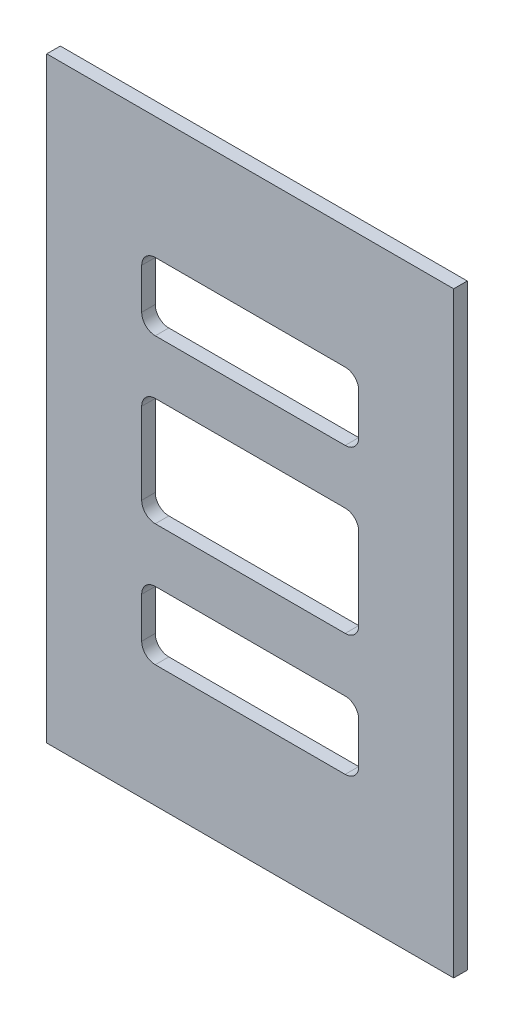
ISO-10303-21;
HEADER;
FILE_DESCRIPTION(('STEP AP214'),'2;1');
FILE_NAME('part.step','',(''),(''),'','','');
FILE_SCHEMA(('AUTOMOTIVE_DESIGN { 1 0 10303 214 1 1 1 1 }'));
ENDSEC;
DATA;
#1=APPLICATION_CONTEXT('core data for automotive mechanical design processes');
#2=APPLICATION_PROTOCOL_DEFINITION('international standard','automotive_design',2000,#1);
#3=PRODUCT_CONTEXT('',#1,'mechanical');
#4=PRODUCT('Part','Part','',(#3));
#5=PRODUCT_RELATED_PRODUCT_CATEGORY('part','',(#4));
#6=PRODUCT_DEFINITION_FORMATION('','',#4);
#7=PRODUCT_DEFINITION_CONTEXT('part definition',#1,'design');
#8=PRODUCT_DEFINITION('design','',#6,#7);
#9=PRODUCT_DEFINITION_SHAPE('','',#8);
#10=(LENGTH_UNIT() NAMED_UNIT(*) SI_UNIT(.MILLI.,.METRE.));
#11=(NAMED_UNIT(*) PLANE_ANGLE_UNIT() SI_UNIT($,.RADIAN.));
#12=(NAMED_UNIT(*) SI_UNIT($,.STERADIAN.) SOLID_ANGLE_UNIT());
#13=UNCERTAINTY_MEASURE_WITH_UNIT(LENGTH_MEASURE(1.E-05),#10,'distance_accuracy_value','');
#14=(GEOMETRIC_REPRESENTATION_CONTEXT(3) GLOBAL_UNCERTAINTY_ASSIGNED_CONTEXT((#13)) GLOBAL_UNIT_ASSIGNED_CONTEXT((#10,
#11,#12)) REPRESENTATION_CONTEXT('',''));
#15=CARTESIAN_POINT('',(0.,0.,0.));
#16=DIRECTION('',(0.,0.,1.));
#17=DIRECTION('',(1.,0.,0.));
#18=AXIS2_PLACEMENT_3D('',#15,#16,#17);
#19=CARTESIAN_POINT('',(0.,0.,1.));
#20=DIRECTION('',(0.,0.,-1.));
#21=DIRECTION('',(-1.,0.,0.));
#22=AXIS2_PLACEMENT_3D('',#19,#20,#21);
#23=PLANE('',#22);
#24=CARTESIAN_POINT('',(7.,3.,1.));
#25=DIRECTION('',(0.,0.,1.));
#26=DIRECTION('',(-1.,0.,0.));
#27=AXIS2_PLACEMENT_3D('',#24,#25,#26);
#28=CIRCLE('',#27,1.);
#29=CARTESIAN_POINT('',(8.,2.99999999999999,1.));
#30=VERTEX_POINT('',#29);
#31=CARTESIAN_POINT('',(7.,4.,1.));
#32=VERTEX_POINT('',#31);
#33=EDGE_CURVE('E318',#30,#32,#28,.T.);
#34=ORIENTED_EDGE('',*,*,#33,.F.);
#35=DIRECTION('',(0.,1.,0.));
#36=VECTOR('',#35,1.);
#37=CARTESIAN_POINT('',(8.,-2.99999999999999,1.));
#38=LINE('',#37,#36);
#39=CARTESIAN_POINT('',(8.,-3.,1.));
#40=VERTEX_POINT('',#39);
#41=EDGE_CURVE('E341',#40,#30,#38,.T.);
#42=ORIENTED_EDGE('',*,*,#41,.F.);
#43=CARTESIAN_POINT('',(7.,-3.,1.));
#44=DIRECTION('',(0.,0.,1.));
#45=DIRECTION('',(1.,0.,0.));
#46=AXIS2_PLACEMENT_3D('',#43,#44,#45);
#47=CIRCLE('',#46,1.);
#48=CARTESIAN_POINT('',(7.,-4.,1.));
#49=VERTEX_POINT('',#48);
#50=EDGE_CURVE('E337',#49,#40,#47,.T.);
#51=ORIENTED_EDGE('',*,*,#50,.F.);
#52=DIRECTION('',(1.,0.,0.));
#53=VECTOR('',#52,1.);
#54=CARTESIAN_POINT('',(-6.99999999999999,-4.,1.));
#55=LINE('',#54,#53);
#56=CARTESIAN_POINT('',(-6.99999999999999,-4.,1.));
#57=VERTEX_POINT('',#56);
#58=EDGE_CURVE('E334',#57,#49,#55,.T.);
#59=ORIENTED_EDGE('',*,*,#58,.F.);
#60=CARTESIAN_POINT('',(-7.,-3.,1.));
#61=DIRECTION('',(0.,0.,1.));
#62=DIRECTION('',(-1.,0.,0.));
#63=AXIS2_PLACEMENT_3D('',#60,#61,#62);
#64=CIRCLE('',#63,1.);
#65=CARTESIAN_POINT('',(-8.,-2.99999999999999,1.));
#66=VERTEX_POINT('',#65);
#67=EDGE_CURVE('E331',#66,#57,#64,.T.);
#68=ORIENTED_EDGE('',*,*,#67,.F.);
#69=DIRECTION('',(0.,-1.,0.));
#70=VECTOR('',#69,1.);
#71=CARTESIAN_POINT('',(-8.,-2.99999999999999,1.));
#72=LINE('',#71,#70);
#73=CARTESIAN_POINT('',(-8.,2.99999999999999,1.));
#74=VERTEX_POINT('',#73);
#75=EDGE_CURVE('E328',#74,#66,#72,.T.);
#76=ORIENTED_EDGE('',*,*,#75,.F.);
#77=CARTESIAN_POINT('',(-7.,3.,1.));
#78=DIRECTION('',(0.,0.,1.));
#79=DIRECTION('',(-1.,0.,0.));
#80=AXIS2_PLACEMENT_3D('',#77,#78,#79);
#81=CIRCLE('',#80,1.);
#82=CARTESIAN_POINT('',(-6.99999999999999,4.,1.));
#83=VERTEX_POINT('',#82);
#84=EDGE_CURVE('E325',#83,#74,#81,.T.);
#85=ORIENTED_EDGE('',*,*,#84,.F.);
#86=DIRECTION('',(-1.,0.,0.));
#87=VECTOR('',#86,1.);
#88=CARTESIAN_POINT('',(-6.99999999999999,4.,1.));
#89=LINE('',#88,#87);
#90=EDGE_CURVE('E321',#32,#83,#89,.T.);
#91=ORIENTED_EDGE('',*,*,#90,.F.);
#92=EDGE_LOOP('',(#34,#42,#51,#59,#68,#76,#85,#91));
#93=FACE_BOUND('',#92,.T.);
#94=DIRECTION('',(0.,1.,0.));
#95=VECTOR('',#94,1.);
#96=CARTESIAN_POINT('',(15.,-22.,1.));
#97=LINE('',#96,#95);
#98=CARTESIAN_POINT('',(15.,-22.,1.));
#99=VERTEX_POINT('',#98);
#100=CARTESIAN_POINT('',(15.,22.,1.));
#101=VERTEX_POINT('',#100);
#102=EDGE_CURVE('E484',#99,#101,#97,.T.);
#103=ORIENTED_EDGE('',*,*,#102,.T.);
#104=DIRECTION('',(-1.,0.,0.));
#105=VECTOR('',#104,1.);
#106=CARTESIAN_POINT('',(-15.,22.,1.));
#107=LINE('',#106,#105);
#108=CARTESIAN_POINT('',(-15.,22.,1.));
#109=VERTEX_POINT('',#108);
#110=EDGE_CURVE('E488',#101,#109,#107,.T.);
#111=ORIENTED_EDGE('',*,*,#110,.T.);
#112=DIRECTION('',(0.,-1.,0.));
#113=VECTOR('',#112,1.);
#114=CARTESIAN_POINT('',(-15.,-22.,1.));
#115=LINE('',#114,#113);
#116=CARTESIAN_POINT('',(-15.,-22.,1.));
#117=VERTEX_POINT('',#116);
#118=EDGE_CURVE('E492',#109,#117,#115,.T.);
#119=ORIENTED_EDGE('',*,*,#118,.T.);
#120=DIRECTION('',(1.,0.,0.));
#121=VECTOR('',#120,1.);
#122=CARTESIAN_POINT('',(-15.,-22.,1.));
#123=LINE('',#122,#121);
#124=EDGE_CURVE('E495',#117,#99,#123,.T.);
#125=ORIENTED_EDGE('',*,*,#124,.T.);
#126=EDGE_LOOP('',(#103,#111,#119,#125));
#127=FACE_BOUND('',#126,.T.);
#128=CARTESIAN_POINT('',(-7.,-12.,1.));
#129=DIRECTION('',(0.,0.,1.));
#130=DIRECTION('',(-1.,0.,0.));
#131=AXIS2_PLACEMENT_3D('',#128,#129,#130);
#132=CIRCLE('',#131,1.);
#133=CARTESIAN_POINT('',(-8.,-12.,1.));
#134=VERTEX_POINT('',#133);
#135=CARTESIAN_POINT('',(-6.99999999999999,-13.,1.));
#136=VERTEX_POINT('',#135);
#137=EDGE_CURVE('E401',#134,#136,#132,.T.);
#138=ORIENTED_EDGE('',*,*,#137,.F.);
#139=DIRECTION('',(0.,-1.,0.));
#140=VECTOR('',#139,1.);
#141=CARTESIAN_POINT('',(-8.,-12.,1.));
#142=LINE('',#141,#140);
#143=CARTESIAN_POINT('',(-8.,-9.00000000000001,1.));
#144=VERTEX_POINT('',#143);
#145=EDGE_CURVE('E424',#144,#134,#142,.T.);
#146=ORIENTED_EDGE('',*,*,#145,.F.);
#147=CARTESIAN_POINT('',(-7.,-9.,1.));
#148=DIRECTION('',(0.,0.,1.));
#149=DIRECTION('',(-1.,0.,0.));
#150=AXIS2_PLACEMENT_3D('',#147,#148,#149);
#151=CIRCLE('',#150,1.);
#152=CARTESIAN_POINT('',(-7.,-8.,1.));
#153=VERTEX_POINT('',#152);
#154=EDGE_CURVE('E420',#153,#144,#151,.T.);
#155=ORIENTED_EDGE('',*,*,#154,.F.);
#156=DIRECTION('',(-1.,0.,0.));
#157=VECTOR('',#156,1.);
#158=CARTESIAN_POINT('',(-7.,-8.,1.));
#159=LINE('',#158,#157);
#160=CARTESIAN_POINT('',(6.99999999999999,-8.,1.));
#161=VERTEX_POINT('',#160);
#162=EDGE_CURVE('E417',#161,#153,#159,.T.);
#163=ORIENTED_EDGE('',*,*,#162,.F.);
#164=CARTESIAN_POINT('',(7.,-9.,1.));
#165=DIRECTION('',(0.,0.,1.));
#166=DIRECTION('',(-1.,0.,0.));
#167=AXIS2_PLACEMENT_3D('',#164,#165,#166);
#168=CIRCLE('',#167,1.);
#169=CARTESIAN_POINT('',(8.,-9.00000000000001,1.));
#170=VERTEX_POINT('',#169);
#171=EDGE_CURVE('E414',#170,#161,#168,.T.);
#172=ORIENTED_EDGE('',*,*,#171,.F.);
#173=DIRECTION('',(0.,1.,0.));
#174=VECTOR('',#173,1.);
#175=CARTESIAN_POINT('',(8.,-12.,1.));
#176=LINE('',#175,#174);
#177=CARTESIAN_POINT('',(8.,-12.,1.));
#178=VERTEX_POINT('',#177);
#179=EDGE_CURVE('E411',#178,#170,#176,.T.);
#180=ORIENTED_EDGE('',*,*,#179,.F.);
#181=CARTESIAN_POINT('',(7.,-12.,1.));
#182=DIRECTION('',(0.,0.,1.));
#183=DIRECTION('',(1.,0.,0.));
#184=AXIS2_PLACEMENT_3D('',#181,#182,#183);
#185=CIRCLE('',#184,0.999999999999999);
#186=CARTESIAN_POINT('',(6.99999999999999,-13.,1.));
#187=VERTEX_POINT('',#186);
#188=EDGE_CURVE('E408',#187,#178,#185,.T.);
#189=ORIENTED_EDGE('',*,*,#188,.F.);
#190=DIRECTION('',(1.,0.,0.));
#191=VECTOR('',#190,1.);
#192=CARTESIAN_POINT('',(-6.99999999999999,-13.,1.));
#193=LINE('',#192,#191);
#194=EDGE_CURVE('E404',#136,#187,#193,.T.);
#195=ORIENTED_EDGE('',*,*,#194,.F.);
#196=EDGE_LOOP('',(#138,#146,#155,#163,#172,#180,#189,#195));
#197=FACE_BOUND('',#196,.T.);
#198=CARTESIAN_POINT('',(7.,12.,1.));
#199=DIRECTION('',(0.,0.,1.));
#200=DIRECTION('',(-1.,0.,0.));
#201=AXIS2_PLACEMENT_3D('',#198,#199,#200);
#202=CIRCLE('',#201,1.);
#203=CARTESIAN_POINT('',(8.,12.,1.));
#204=VERTEX_POINT('',#203);
#205=CARTESIAN_POINT('',(6.99999999999999,13.,1.));
#206=VERTEX_POINT('',#205);
#207=EDGE_CURVE('E229',#204,#206,#202,.T.);
#208=ORIENTED_EDGE('',*,*,#207,.F.);
#209=DIRECTION('',(0.,1.,0.));
#210=VECTOR('',#209,1.);
#211=CARTESIAN_POINT('',(8.,9.00000000000001,1.));
#212=LINE('',#211,#210);
#213=CARTESIAN_POINT('',(8.,9.,1.));
#214=VERTEX_POINT('',#213);
#215=EDGE_CURVE('E270',#214,#204,#212,.T.);
#216=ORIENTED_EDGE('',*,*,#215,.F.);
#217=CARTESIAN_POINT('',(7.,9.,1.));
#218=DIRECTION('',(0.,0.,1.));
#219=DIRECTION('',(1.,0.,0.));
#220=AXIS2_PLACEMENT_3D('',#217,#218,#219);
#221=CIRCLE('',#220,1.);
#222=CARTESIAN_POINT('',(6.99999999999999,8.,1.));
#223=VERTEX_POINT('',#222);
#224=EDGE_CURVE('E267',#223,#214,#221,.T.);
#225=ORIENTED_EDGE('',*,*,#224,.F.);
#226=DIRECTION('',(1.,0.,0.));
#227=VECTOR('',#226,1.);
#228=CARTESIAN_POINT('',(-6.99999999999999,8.,1.));
#229=LINE('',#228,#227);
#230=CARTESIAN_POINT('',(-6.99999999999999,8.,1.));
#231=VERTEX_POINT('',#230);
#232=EDGE_CURVE('E264',#231,#223,#229,.T.);
#233=ORIENTED_EDGE('',*,*,#232,.F.);
#234=CARTESIAN_POINT('',(-7.,9.,1.));
#235=DIRECTION('',(0.,0.,1.));
#236=DIRECTION('',(-1.,0.,0.));
#237=AXIS2_PLACEMENT_3D('',#234,#235,#236);
#238=CIRCLE('',#237,1.);
#239=CARTESIAN_POINT('',(-8.,9.00000000000001,1.));
#240=VERTEX_POINT('',#239);
#241=EDGE_CURVE('E261',#240,#231,#238,.T.);
#242=ORIENTED_EDGE('',*,*,#241,.F.);
#243=DIRECTION('',(0.,-1.,0.));
#244=VECTOR('',#243,1.);
#245=CARTESIAN_POINT('',(-8.,9.00000000000001,1.));
#246=LINE('',#245,#244);
#247=CARTESIAN_POINT('',(-8.,12.,1.));
#248=VERTEX_POINT('',#247);
#249=EDGE_CURVE('E256',#248,#240,#246,.T.);
#250=ORIENTED_EDGE('',*,*,#249,.F.);
#251=CARTESIAN_POINT('',(-7.,12.,1.));
#252=DIRECTION('',(0.,0.,1.));
#253=DIRECTION('',(-1.,0.,0.));
#254=AXIS2_PLACEMENT_3D('',#251,#252,#253);
#255=CIRCLE('',#254,1.);
#256=CARTESIAN_POINT('',(-6.99999999999999,13.,1.));
#257=VERTEX_POINT('',#256);
#258=EDGE_CURVE('E252',#257,#248,#255,.T.);
#259=ORIENTED_EDGE('',*,*,#258,.F.);
#260=DIRECTION('',(-1.,0.,0.));
#261=VECTOR('',#260,1.);
#262=CARTESIAN_POINT('',(-6.99999999999999,13.,1.));
#263=LINE('',#262,#261);
#264=EDGE_CURVE('E238',#206,#257,#263,.T.);
#265=ORIENTED_EDGE('',*,*,#264,.F.);
#266=EDGE_LOOP('',(#208,#216,#225,#233,#242,#250,#259,#265));
#267=FACE_BOUND('',#266,.T.);
#268=ADVANCED_FACE('F43',(#93,#127,#197,#267),#23,.F.);
#269=CARTESIAN_POINT('',(0.,0.,0.));
#270=DIRECTION('',(0.,0.,-1.));
#271=DIRECTION('',(-1.,0.,0.));
#272=AXIS2_PLACEMENT_3D('',#269,#270,#271);
#273=PLANE('',#272);
#274=DIRECTION('',(0.,1.,0.));
#275=VECTOR('',#274,1.);
#276=CARTESIAN_POINT('',(15.,-22.,0.));
#277=LINE('',#276,#275);
#278=CARTESIAN_POINT('',(15.,-22.,0.));
#279=VERTEX_POINT('',#278);
#280=CARTESIAN_POINT('',(15.,22.,0.));
#281=VERTEX_POINT('',#280);
#282=EDGE_CURVE('E483',#279,#281,#277,.T.);
#283=ORIENTED_EDGE('',*,*,#282,.F.);
#284=DIRECTION('',(1.,0.,0.));
#285=VECTOR('',#284,1.);
#286=CARTESIAN_POINT('',(-15.,-22.,0.));
#287=LINE('',#286,#285);
#288=CARTESIAN_POINT('',(-15.,-22.,0.));
#289=VERTEX_POINT('',#288);
#290=EDGE_CURVE('E489',#289,#279,#287,.T.);
#291=ORIENTED_EDGE('',*,*,#290,.F.);
#292=DIRECTION('',(0.,-1.,0.));
#293=VECTOR('',#292,1.);
#294=CARTESIAN_POINT('',(-15.,-22.,0.));
#295=LINE('',#294,#293);
#296=CARTESIAN_POINT('',(-15.,22.,0.));
#297=VERTEX_POINT('',#296);
#298=EDGE_CURVE('E505',#297,#289,#295,.T.);
#299=ORIENTED_EDGE('',*,*,#298,.F.);
#300=DIRECTION('',(-1.,0.,0.));
#301=VECTOR('',#300,1.);
#302=CARTESIAN_POINT('',(-15.,22.,0.));
#303=LINE('',#302,#301);
#304=EDGE_CURVE('E502',#281,#297,#303,.T.);
#305=ORIENTED_EDGE('',*,*,#304,.F.);
#306=EDGE_LOOP('',(#283,#291,#299,#305));
#307=FACE_BOUND('',#306,.T.);
#308=DIRECTION('',(0.,-1.,0.));
#309=VECTOR('',#308,1.);
#310=CARTESIAN_POINT('',(-8.,-12.,0.));
#311=LINE('',#310,#309);
#312=CARTESIAN_POINT('',(-8.,-9.00000000000001,0.));
#313=VERTEX_POINT('',#312);
#314=CARTESIAN_POINT('',(-8.,-12.,0.));
#315=VERTEX_POINT('',#314);
#316=EDGE_CURVE('E405',#313,#315,#311,.T.);
#317=ORIENTED_EDGE('',*,*,#316,.T.);
#318=CARTESIAN_POINT('',(-7.,-12.,0.));
#319=DIRECTION('',(0.,0.,1.));
#320=DIRECTION('',(-1.,0.,0.));
#321=AXIS2_PLACEMENT_3D('',#318,#319,#320);
#322=CIRCLE('',#321,1.);
#323=CARTESIAN_POINT('',(-6.99999999999999,-13.,0.));
#324=VERTEX_POINT('',#323);
#325=EDGE_CURVE('E400',#315,#324,#322,.T.);
#326=ORIENTED_EDGE('',*,*,#325,.T.);
#327=DIRECTION('',(1.,0.,0.));
#328=VECTOR('',#327,1.);
#329=CARTESIAN_POINT('',(-6.99999999999999,-13.,0.));
#330=LINE('',#329,#328);
#331=CARTESIAN_POINT('',(6.99999999999999,-13.,0.));
#332=VERTEX_POINT('',#331);
#333=EDGE_CURVE('E431',#324,#332,#330,.T.);
#334=ORIENTED_EDGE('',*,*,#333,.T.);
#335=CARTESIAN_POINT('',(7.,-12.,0.));
#336=DIRECTION('',(0.,0.,1.));
#337=DIRECTION('',(1.,0.,0.));
#338=AXIS2_PLACEMENT_3D('',#335,#336,#337);
#339=CIRCLE('',#338,0.999999999999999);
#340=CARTESIAN_POINT('',(8.,-12.,0.));
#341=VERTEX_POINT('',#340);
#342=EDGE_CURVE('E435',#332,#341,#339,.T.);
#343=ORIENTED_EDGE('',*,*,#342,.T.);
#344=DIRECTION('',(0.,1.,0.));
#345=VECTOR('',#344,1.);
#346=CARTESIAN_POINT('',(8.,-12.,0.));
#347=LINE('',#346,#345);
#348=CARTESIAN_POINT('',(8.,-9.00000000000001,0.));
#349=VERTEX_POINT('',#348);
#350=EDGE_CURVE('E439',#341,#349,#347,.T.);
#351=ORIENTED_EDGE('',*,*,#350,.T.);
#352=CARTESIAN_POINT('',(7.,-9.,0.));
#353=DIRECTION('',(0.,0.,1.));
#354=DIRECTION('',(-1.,0.,0.));
#355=AXIS2_PLACEMENT_3D('',#352,#353,#354);
#356=CIRCLE('',#355,1.);
#357=CARTESIAN_POINT('',(6.99999999999999,-8.,0.));
#358=VERTEX_POINT('',#357);
#359=EDGE_CURVE('E443',#349,#358,#356,.T.);
#360=ORIENTED_EDGE('',*,*,#359,.T.);
#361=DIRECTION('',(-1.,0.,0.));
#362=VECTOR('',#361,1.);
#363=CARTESIAN_POINT('',(-7.,-8.,0.));
#364=LINE('',#363,#362);
#365=CARTESIAN_POINT('',(-7.,-8.,0.));
#366=VERTEX_POINT('',#365);
#367=EDGE_CURVE('E447',#358,#366,#364,.T.);
#368=ORIENTED_EDGE('',*,*,#367,.T.);
#369=CARTESIAN_POINT('',(-7.,-9.,0.));
#370=DIRECTION('',(0.,0.,1.));
#371=DIRECTION('',(-1.,0.,0.));
#372=AXIS2_PLACEMENT_3D('',#369,#370,#371);
#373=CIRCLE('',#372,1.);
#374=EDGE_CURVE('E451',#366,#313,#373,.T.);
#375=ORIENTED_EDGE('',*,*,#374,.T.);
#376=EDGE_LOOP('',(#317,#326,#334,#343,#351,#360,#368,#375));
#377=FACE_BOUND('',#376,.T.);
#378=DIRECTION('',(0.,1.,0.));
#379=VECTOR('',#378,1.);
#380=CARTESIAN_POINT('',(8.,-2.99999999999999,0.));
#381=LINE('',#380,#379);
#382=CARTESIAN_POINT('',(8.,-3.,0.));
#383=VERTEX_POINT('',#382);
#384=CARTESIAN_POINT('',(8.,2.99999999999999,0.));
#385=VERTEX_POINT('',#384);
#386=EDGE_CURVE('E322',#383,#385,#381,.T.);
#387=ORIENTED_EDGE('',*,*,#386,.T.);
#388=CARTESIAN_POINT('',(7.,3.,0.));
#389=DIRECTION('',(0.,0.,1.));
#390=DIRECTION('',(-1.,0.,0.));
#391=AXIS2_PLACEMENT_3D('',#388,#389,#390);
#392=CIRCLE('',#391,1.);
#393=CARTESIAN_POINT('',(7.,4.,0.));
#394=VERTEX_POINT('',#393);
#395=EDGE_CURVE('E247',#385,#394,#392,.T.);
#396=ORIENTED_EDGE('',*,*,#395,.T.);
#397=DIRECTION('',(-1.,0.,0.));
#398=VECTOR('',#397,1.);
#399=CARTESIAN_POINT('',(-6.99999999999999,4.,0.));
#400=LINE('',#399,#398);
#401=CARTESIAN_POINT('',(-6.99999999999999,4.,0.));
#402=VERTEX_POINT('',#401);
#403=EDGE_CURVE('E348',#394,#402,#400,.T.);
#404=ORIENTED_EDGE('',*,*,#403,.T.);
#405=CARTESIAN_POINT('',(-7.,3.,0.));
#406=DIRECTION('',(0.,0.,1.));
#407=DIRECTION('',(-1.,0.,0.));
#408=AXIS2_PLACEMENT_3D('',#405,#406,#407);
#409=CIRCLE('',#408,1.);
#410=CARTESIAN_POINT('',(-8.,2.99999999999999,0.));
#411=VERTEX_POINT('',#410);
#412=EDGE_CURVE('E352',#402,#411,#409,.T.);
#413=ORIENTED_EDGE('',*,*,#412,.T.);
#414=DIRECTION('',(0.,-1.,0.));
#415=VECTOR('',#414,1.);
#416=CARTESIAN_POINT('',(-8.,-2.99999999999999,0.));
#417=LINE('',#416,#415);
#418=CARTESIAN_POINT('',(-8.,-2.99999999999999,0.));
#419=VERTEX_POINT('',#418);
#420=EDGE_CURVE('E356',#411,#419,#417,.T.);
#421=ORIENTED_EDGE('',*,*,#420,.T.);
#422=CARTESIAN_POINT('',(-7.,-3.,0.));
#423=DIRECTION('',(0.,0.,1.));
#424=DIRECTION('',(-1.,0.,0.));
#425=AXIS2_PLACEMENT_3D('',#422,#423,#424);
#426=CIRCLE('',#425,1.);
#427=CARTESIAN_POINT('',(-6.99999999999999,-4.,0.));
#428=VERTEX_POINT('',#427);
#429=EDGE_CURVE('E360',#419,#428,#426,.T.);
#430=ORIENTED_EDGE('',*,*,#429,.T.);
#431=DIRECTION('',(1.,0.,0.));
#432=VECTOR('',#431,1.);
#433=CARTESIAN_POINT('',(-6.99999999999999,-4.,0.));
#434=LINE('',#433,#432);
#435=CARTESIAN_POINT('',(7.,-4.,0.));
#436=VERTEX_POINT('',#435);
#437=EDGE_CURVE('E364',#428,#436,#434,.T.);
#438=ORIENTED_EDGE('',*,*,#437,.T.);
#439=CARTESIAN_POINT('',(7.,-3.,0.));
#440=DIRECTION('',(0.,0.,1.));
#441=DIRECTION('',(1.,0.,0.));
#442=AXIS2_PLACEMENT_3D('',#439,#440,#441);
#443=CIRCLE('',#442,1.);
#444=EDGE_CURVE('E368',#436,#383,#443,.T.);
#445=ORIENTED_EDGE('',*,*,#444,.T.);
#446=EDGE_LOOP('',(#387,#396,#404,#413,#421,#430,#438,#445));
#447=FACE_BOUND('',#446,.T.);
#448=DIRECTION('',(0.,1.,0.));
#449=VECTOR('',#448,1.);
#450=CARTESIAN_POINT('',(8.,9.00000000000001,0.));
#451=LINE('',#450,#449);
#452=CARTESIAN_POINT('',(8.,9.,0.));
#453=VERTEX_POINT('',#452);
#454=CARTESIAN_POINT('',(8.,12.,0.));
#455=VERTEX_POINT('',#454);
#456=EDGE_CURVE('E239',#453,#455,#451,.T.);
#457=ORIENTED_EDGE('',*,*,#456,.T.);
#458=CARTESIAN_POINT('',(7.,12.,0.));
#459=DIRECTION('',(0.,0.,1.));
#460=DIRECTION('',(-1.,0.,0.));
#461=AXIS2_PLACEMENT_3D('',#458,#459,#460);
#462=CIRCLE('',#461,1.);
#463=CARTESIAN_POINT('',(6.99999999999999,13.,0.));
#464=VERTEX_POINT('',#463);
#465=EDGE_CURVE('E67',#455,#464,#462,.T.);
#466=ORIENTED_EDGE('',*,*,#465,.T.);
#467=DIRECTION('',(-1.,0.,0.));
#468=VECTOR('',#467,1.);
#469=CARTESIAN_POINT('',(-6.99999999999999,13.,0.));
#470=LINE('',#469,#468);
#471=CARTESIAN_POINT('',(-6.99999999999999,13.,0.));
#472=VERTEX_POINT('',#471);
#473=EDGE_CURVE('E245',#464,#472,#470,.T.);
#474=ORIENTED_EDGE('',*,*,#473,.T.);
#475=CARTESIAN_POINT('',(-7.,12.,0.));
#476=DIRECTION('',(0.,0.,1.));
#477=DIRECTION('',(-1.,0.,0.));
#478=AXIS2_PLACEMENT_3D('',#475,#476,#477);
#479=CIRCLE('',#478,1.);
#480=CARTESIAN_POINT('',(-8.,12.,0.));
#481=VERTEX_POINT('',#480);
#482=EDGE_CURVE('E277',#472,#481,#479,.T.);
#483=ORIENTED_EDGE('',*,*,#482,.T.);
#484=DIRECTION('',(0.,-1.,0.));
#485=VECTOR('',#484,1.);
#486=CARTESIAN_POINT('',(-8.,9.00000000000001,0.));
#487=LINE('',#486,#485);
#488=CARTESIAN_POINT('',(-8.,9.00000000000001,0.));
#489=VERTEX_POINT('',#488);
#490=EDGE_CURVE('E281',#481,#489,#487,.T.);
#491=ORIENTED_EDGE('',*,*,#490,.T.);
#492=CARTESIAN_POINT('',(-7.,9.,0.));
#493=DIRECTION('',(0.,0.,1.));
#494=DIRECTION('',(-1.,0.,0.));
#495=AXIS2_PLACEMENT_3D('',#492,#493,#494);
#496=CIRCLE('',#495,1.);
#497=CARTESIAN_POINT('',(-6.99999999999999,8.,0.));
#498=VERTEX_POINT('',#497);
#499=EDGE_CURVE('E285',#489,#498,#496,.T.);
#500=ORIENTED_EDGE('',*,*,#499,.T.);
#501=DIRECTION('',(1.,0.,0.));
#502=VECTOR('',#501,1.);
#503=CARTESIAN_POINT('',(-6.99999999999999,8.,0.));
#504=LINE('',#503,#502);
#505=CARTESIAN_POINT('',(6.99999999999999,8.,0.));
#506=VERTEX_POINT('',#505);
#507=EDGE_CURVE('E289',#498,#506,#504,.T.);
#508=ORIENTED_EDGE('',*,*,#507,.T.);
#509=CARTESIAN_POINT('',(7.,9.,0.));
#510=DIRECTION('',(0.,0.,1.));
#511=DIRECTION('',(1.,0.,0.));
#512=AXIS2_PLACEMENT_3D('',#509,#510,#511);
#513=CIRCLE('',#512,1.);
#514=EDGE_CURVE('E293',#506,#453,#513,.T.);
#515=ORIENTED_EDGE('',*,*,#514,.T.);
#516=EDGE_LOOP('',(#457,#466,#474,#483,#491,#500,#508,#515));
#517=FACE_BOUND('',#516,.T.);
#518=ADVANCED_FACE('F528',(#307,#377,#447,#517),#273,.T.);
#519=CARTESIAN_POINT('',(15.,-22.,1.));
#520=DIRECTION('',(-1.,0.,0.));
#521=DIRECTION('',(0.,0.,1.));
#522=AXIS2_PLACEMENT_3D('',#519,#520,#521);
#523=PLANE('',#522);
#524=ORIENTED_EDGE('',*,*,#282,.T.);
#525=DIRECTION('',(0.,0.,-1.));
#526=VECTOR('',#525,1.);
#527=CARTESIAN_POINT('',(15.,22.,1.));
#528=LINE('',#527,#526);
#529=EDGE_CURVE('E11',#101,#281,#528,.T.);
#530=ORIENTED_EDGE('',*,*,#529,.F.);
#531=ORIENTED_EDGE('',*,*,#102,.F.);
#532=DIRECTION('',(0.,0.,-1.));
#533=VECTOR('',#532,1.);
#534=CARTESIAN_POINT('',(15.,-22.,1.));
#535=LINE('',#534,#533);
#536=EDGE_CURVE('E498',#99,#279,#535,.T.);
#537=ORIENTED_EDGE('',*,*,#536,.T.);
#538=EDGE_LOOP('',(#524,#530,#531,#537));
#539=FACE_BOUND('',#538,.T.);
#540=ADVANCED_FACE('F45',(#539),#523,.F.);
#541=CARTESIAN_POINT('',(-15.,22.,1.));
#542=DIRECTION('',(0.,-1.,0.));
#543=DIRECTION('',(0.,0.,-1.));
#544=AXIS2_PLACEMENT_3D('',#541,#542,#543);
#545=PLANE('',#544);
#546=ORIENTED_EDGE('',*,*,#304,.T.);
#547=DIRECTION('',(0.,0.,-1.));
#548=VECTOR('',#547,1.);
#549=CARTESIAN_POINT('',(-15.,22.,1.));
#550=LINE('',#549,#548);
#551=EDGE_CURVE('E52',#109,#297,#550,.T.);
#552=ORIENTED_EDGE('',*,*,#551,.F.);
#553=ORIENTED_EDGE('',*,*,#110,.F.);
#554=ORIENTED_EDGE('',*,*,#529,.T.);
#555=EDGE_LOOP('',(#546,#552,#553,#554));
#556=FACE_BOUND('',#555,.T.);
#557=ADVANCED_FACE('F539',(#556),#545,.F.);
#558=CARTESIAN_POINT('',(-15.,-22.,1.));
#559=DIRECTION('',(1.,0.,0.));
#560=DIRECTION('',(0.,0.,-1.));
#561=AXIS2_PLACEMENT_3D('',#558,#559,#560);
#562=PLANE('',#561);
#563=ORIENTED_EDGE('',*,*,#298,.T.);
#564=DIRECTION('',(0.,0.,-1.));
#565=VECTOR('',#564,1.);
#566=CARTESIAN_POINT('',(-15.,-22.,1.));
#567=LINE('',#566,#565);
#568=EDGE_CURVE('E513',#117,#289,#567,.T.);
#569=ORIENTED_EDGE('',*,*,#568,.F.);
#570=ORIENTED_EDGE('',*,*,#118,.F.);
#571=ORIENTED_EDGE('',*,*,#551,.T.);
#572=EDGE_LOOP('',(#563,#569,#570,#571));
#573=FACE_BOUND('',#572,.T.);
#574=ADVANCED_FACE('F522',(#573),#562,.F.);
#575=CARTESIAN_POINT('',(-15.,-22.,1.));
#576=DIRECTION('',(0.,1.,0.));
#577=DIRECTION('',(0.,0.,1.));
#578=AXIS2_PLACEMENT_3D('',#575,#576,#577);
#579=PLANE('',#578);
#580=ORIENTED_EDGE('',*,*,#290,.T.);
#581=ORIENTED_EDGE('',*,*,#536,.F.);
#582=ORIENTED_EDGE('',*,*,#124,.F.);
#583=ORIENTED_EDGE('',*,*,#568,.T.);
#584=EDGE_LOOP('',(#580,#581,#582,#583));
#585=FACE_BOUND('',#584,.T.);
#586=ADVANCED_FACE('F532',(#585),#579,.F.);
#587=CARTESIAN_POINT('',(-7.,-12.,1.));
#588=DIRECTION('',(0.,0.,-1.));
#589=DIRECTION('',(-1.,0.,0.));
#590=AXIS2_PLACEMENT_3D('',#587,#588,#589);
#591=CYLINDRICAL_SURFACE('',#590,1.);
#592=ORIENTED_EDGE('',*,*,#325,.F.);
#593=DIRECTION('',(0.,0.,-1.));
#594=VECTOR('',#593,1.);
#595=CARTESIAN_POINT('',(-8.,-12.,1.));
#596=LINE('',#595,#594);
#597=EDGE_CURVE('E427',#134,#315,#596,.T.);
#598=ORIENTED_EDGE('',*,*,#597,.F.);
#599=ORIENTED_EDGE('',*,*,#137,.T.);
#600=DIRECTION('',(0.,0.,-1.));
#601=VECTOR('',#600,1.);
#602=CARTESIAN_POINT('',(-6.99999999999999,-13.,1.));
#603=LINE('',#602,#601);
#604=EDGE_CURVE('E479',#136,#324,#603,.T.);
#605=ORIENTED_EDGE('',*,*,#604,.T.);
#606=EDGE_LOOP('',(#592,#598,#599,#605));
#607=FACE_BOUND('',#606,.T.);
#608=ADVANCED_FACE('F555',(#607),#591,.F.);
#609=CARTESIAN_POINT('',(-6.99999999999999,-13.,1.));
#610=DIRECTION('',(0.,1.,0.));
#611=DIRECTION('',(0.,0.,1.));
#612=AXIS2_PLACEMENT_3D('',#609,#610,#611);
#613=PLANE('',#612);
#614=ORIENTED_EDGE('',*,*,#333,.F.);
#615=ORIENTED_EDGE('',*,*,#604,.F.);
#616=ORIENTED_EDGE('',*,*,#194,.T.);
#617=DIRECTION('',(0.,0.,-1.));
#618=VECTOR('',#617,1.);
#619=CARTESIAN_POINT('',(6.99999999999999,-13.,1.));
#620=LINE('',#619,#618);
#621=EDGE_CURVE('E476',#187,#332,#620,.T.);
#622=ORIENTED_EDGE('',*,*,#621,.T.);
#623=EDGE_LOOP('',(#614,#615,#616,#622));
#624=FACE_BOUND('',#623,.T.);
#625=ADVANCED_FACE('F562',(#624),#613,.T.);
#626=CARTESIAN_POINT('',(7.,-12.,1.));
#627=DIRECTION('',(0.,0.,-1.));
#628=DIRECTION('',(-1.,0.,0.));
#629=AXIS2_PLACEMENT_3D('',#626,#627,#628);
#630=CYLINDRICAL_SURFACE('',#629,0.999999999999999);
#631=ORIENTED_EDGE('',*,*,#342,.F.);
#632=ORIENTED_EDGE('',*,*,#621,.F.);
#633=ORIENTED_EDGE('',*,*,#188,.T.);
#634=DIRECTION('',(0.,0.,-1.));
#635=VECTOR('',#634,1.);
#636=CARTESIAN_POINT('',(8.,-12.,1.));
#637=LINE('',#636,#635);
#638=EDGE_CURVE('E473',#178,#341,#637,.T.);
#639=ORIENTED_EDGE('',*,*,#638,.T.);
#640=EDGE_LOOP('',(#631,#632,#633,#639));
#641=FACE_BOUND('',#640,.T.);
#642=ADVANCED_FACE('F567',(#641),#630,.F.);
#643=CARTESIAN_POINT('',(8.,-12.,1.));
#644=DIRECTION('',(-1.,0.,0.));
#645=DIRECTION('',(0.,-1.,0.));
#646=AXIS2_PLACEMENT_3D('',#643,#644,#645);
#647=PLANE('',#646);
#648=ORIENTED_EDGE('',*,*,#350,.F.);
#649=ORIENTED_EDGE('',*,*,#638,.F.);
#650=ORIENTED_EDGE('',*,*,#179,.T.);
#651=DIRECTION('',(0.,0.,-1.));
#652=VECTOR('',#651,1.);
#653=CARTESIAN_POINT('',(8.,-9.00000000000001,1.));
#654=LINE('',#653,#652);
#655=EDGE_CURVE('E470',#170,#349,#654,.T.);
#656=ORIENTED_EDGE('',*,*,#655,.T.);
#657=EDGE_LOOP('',(#648,#649,#650,#656));
#658=FACE_BOUND('',#657,.T.);
#659=ADVANCED_FACE('F593',(#658),#647,.T.);
#660=CARTESIAN_POINT('',(7.,-9.,1.));
#661=DIRECTION('',(0.,0.,-1.));
#662=DIRECTION('',(-1.,0.,0.));
#663=AXIS2_PLACEMENT_3D('',#660,#661,#662);
#664=CYLINDRICAL_SURFACE('',#663,1.);
#665=ORIENTED_EDGE('',*,*,#359,.F.);
#666=ORIENTED_EDGE('',*,*,#655,.F.);
#667=ORIENTED_EDGE('',*,*,#171,.T.);
#668=DIRECTION('',(0.,0.,-1.));
#669=VECTOR('',#668,1.);
#670=CARTESIAN_POINT('',(6.99999999999999,-8.,1.));
#671=LINE('',#670,#669);
#672=EDGE_CURVE('E467',#161,#358,#671,.T.);
#673=ORIENTED_EDGE('',*,*,#672,.T.);
#674=EDGE_LOOP('',(#665,#666,#667,#673));
#675=FACE_BOUND('',#674,.T.);
#676=ADVANCED_FACE('F598',(#675),#664,.F.);
#677=CARTESIAN_POINT('',(-7.,-8.,1.));
#678=DIRECTION('',(0.,-1.,0.));
#679=DIRECTION('',(0.,0.,-1.));
#680=AXIS2_PLACEMENT_3D('',#677,#678,#679);
#681=PLANE('',#680);
#682=ORIENTED_EDGE('',*,*,#367,.F.);
#683=ORIENTED_EDGE('',*,*,#672,.F.);
#684=ORIENTED_EDGE('',*,*,#162,.T.);
#685=DIRECTION('',(0.,0.,-1.));
#686=VECTOR('',#685,1.);
#687=CARTESIAN_POINT('',(-7.,-8.,1.));
#688=LINE('',#687,#686);
#689=EDGE_CURVE('E464',#153,#366,#688,.T.);
#690=ORIENTED_EDGE('',*,*,#689,.T.);
#691=EDGE_LOOP('',(#682,#683,#684,#690));
#692=FACE_BOUND('',#691,.T.);
#693=ADVANCED_FACE('F601',(#692),#681,.T.);
#694=CARTESIAN_POINT('',(-7.,-9.,1.));
#695=DIRECTION('',(0.,0.,-1.));
#696=DIRECTION('',(-1.,0.,0.));
#697=AXIS2_PLACEMENT_3D('',#694,#695,#696);
#698=CYLINDRICAL_SURFACE('',#697,1.);
#699=ORIENTED_EDGE('',*,*,#374,.F.);
#700=ORIENTED_EDGE('',*,*,#689,.F.);
#701=ORIENTED_EDGE('',*,*,#154,.T.);
#702=DIRECTION('',(0.,0.,-1.));
#703=VECTOR('',#702,1.);
#704=CARTESIAN_POINT('',(-8.,-9.00000000000001,1.));
#705=LINE('',#704,#703);
#706=EDGE_CURVE('E461',#144,#313,#705,.T.);
#707=ORIENTED_EDGE('',*,*,#706,.T.);
#708=EDGE_LOOP('',(#699,#700,#701,#707));
#709=FACE_BOUND('',#708,.T.);
#710=ADVANCED_FACE('F581',(#709),#698,.F.);
#711=CARTESIAN_POINT('',(-8.,-12.,1.));
#712=DIRECTION('',(1.,0.,0.));
#713=DIRECTION('',(0.,1.,0.));
#714=AXIS2_PLACEMENT_3D('',#711,#712,#713);
#715=PLANE('',#714);
#716=ORIENTED_EDGE('',*,*,#316,.F.);
#717=ORIENTED_EDGE('',*,*,#706,.F.);
#718=ORIENTED_EDGE('',*,*,#145,.T.);
#719=ORIENTED_EDGE('',*,*,#597,.T.);
#720=EDGE_LOOP('',(#716,#717,#718,#719));
#721=FACE_BOUND('',#720,.T.);
#722=ADVANCED_FACE('F574',(#721),#715,.T.);
#723=CARTESIAN_POINT('',(7.,3.,1.));
#724=DIRECTION('',(0.,0.,-1.));
#725=DIRECTION('',(-1.,0.,0.));
#726=AXIS2_PLACEMENT_3D('',#723,#724,#725);
#727=CYLINDRICAL_SURFACE('',#726,1.);
#728=ORIENTED_EDGE('',*,*,#395,.F.);
#729=DIRECTION('',(0.,0.,-1.));
#730=VECTOR('',#729,1.);
#731=CARTESIAN_POINT('',(8.,2.99999999999999,1.));
#732=LINE('',#731,#730);
#733=EDGE_CURVE('E344',#30,#385,#732,.T.);
#734=ORIENTED_EDGE('',*,*,#733,.F.);
#735=ORIENTED_EDGE('',*,*,#33,.T.);
#736=DIRECTION('',(0.,0.,-1.));
#737=VECTOR('',#736,1.);
#738=CARTESIAN_POINT('',(7.,4.,1.));
#739=LINE('',#738,#737);
#740=EDGE_CURVE('E396',#32,#394,#739,.T.);
#741=ORIENTED_EDGE('',*,*,#740,.T.);
#742=EDGE_LOOP('',(#728,#734,#735,#741));
#743=FACE_BOUND('',#742,.T.);
#744=ADVANCED_FACE('F649',(#743),#727,.F.);
#745=CARTESIAN_POINT('',(-6.99999999999999,4.,1.));
#746=DIRECTION('',(0.,-1.,0.));
#747=DIRECTION('',(0.,0.,-1.));
#748=AXIS2_PLACEMENT_3D('',#745,#746,#747);
#749=PLANE('',#748);
#750=ORIENTED_EDGE('',*,*,#403,.F.);
#751=ORIENTED_EDGE('',*,*,#740,.F.);
#752=ORIENTED_EDGE('',*,*,#90,.T.);
#753=DIRECTION('',(0.,0.,-1.));
#754=VECTOR('',#753,1.);
#755=CARTESIAN_POINT('',(-6.99999999999999,4.,1.));
#756=LINE('',#755,#754);
#757=EDGE_CURVE('E393',#83,#402,#756,.T.);
#758=ORIENTED_EDGE('',*,*,#757,.T.);
#759=EDGE_LOOP('',(#750,#751,#752,#758));
#760=FACE_BOUND('',#759,.T.);
#761=ADVANCED_FACE('F658',(#760),#749,.T.);
#762=CARTESIAN_POINT('',(-7.,3.,1.));
#763=DIRECTION('',(0.,0.,-1.));
#764=DIRECTION('',(-1.,0.,0.));
#765=AXIS2_PLACEMENT_3D('',#762,#763,#764);
#766=CYLINDRICAL_SURFACE('',#765,1.);
#767=ORIENTED_EDGE('',*,*,#412,.F.);
#768=ORIENTED_EDGE('',*,*,#757,.F.);
#769=ORIENTED_EDGE('',*,*,#84,.T.);
#770=DIRECTION('',(0.,0.,-1.));
#771=VECTOR('',#770,1.);
#772=CARTESIAN_POINT('',(-8.,2.99999999999999,1.));
#773=LINE('',#772,#771);
#774=EDGE_CURVE('E390',#74,#411,#773,.T.);
#775=ORIENTED_EDGE('',*,*,#774,.T.);
#776=EDGE_LOOP('',(#767,#768,#769,#775));
#777=FACE_BOUND('',#776,.T.);
#778=ADVANCED_FACE('F669',(#777),#766,.F.);
#779=CARTESIAN_POINT('',(-8.,-2.99999999999999,1.));
#780=DIRECTION('',(1.,0.,0.));
#781=DIRECTION('',(0.,0.,-1.));
#782=AXIS2_PLACEMENT_3D('',#779,#780,#781);
#783=PLANE('',#782);
#784=ORIENTED_EDGE('',*,*,#420,.F.);
#785=ORIENTED_EDGE('',*,*,#774,.F.);
#786=ORIENTED_EDGE('',*,*,#75,.T.);
#787=DIRECTION('',(0.,0.,-1.));
#788=VECTOR('',#787,1.);
#789=CARTESIAN_POINT('',(-8.,-2.99999999999999,1.));
#790=LINE('',#789,#788);
#791=EDGE_CURVE('E387',#66,#419,#790,.T.);
#792=ORIENTED_EDGE('',*,*,#791,.T.);
#793=EDGE_LOOP('',(#784,#785,#786,#792));
#794=FACE_BOUND('',#793,.T.);
#795=ADVANCED_FACE('F680',(#794),#783,.T.);
#796=CARTESIAN_POINT('',(-7.,-3.,1.));
#797=DIRECTION('',(0.,0.,-1.));
#798=DIRECTION('',(-1.,0.,0.));
#799=AXIS2_PLACEMENT_3D('',#796,#797,#798);
#800=CYLINDRICAL_SURFACE('',#799,1.);
#801=ORIENTED_EDGE('',*,*,#429,.F.);
#802=ORIENTED_EDGE('',*,*,#791,.F.);
#803=ORIENTED_EDGE('',*,*,#67,.T.);
#804=DIRECTION('',(0.,0.,-1.));
#805=VECTOR('',#804,1.);
#806=CARTESIAN_POINT('',(-6.99999999999999,-4.,1.));
#807=LINE('',#806,#805);
#808=EDGE_CURVE('E384',#57,#428,#807,.T.);
#809=ORIENTED_EDGE('',*,*,#808,.T.);
#810=EDGE_LOOP('',(#801,#802,#803,#809));
#811=FACE_BOUND('',#810,.T.);
#812=ADVANCED_FACE('F691',(#811),#800,.F.);
#813=CARTESIAN_POINT('',(-6.99999999999999,-4.,1.));
#814=DIRECTION('',(0.,1.,0.));
#815=DIRECTION('',(0.,0.,1.));
#816=AXIS2_PLACEMENT_3D('',#813,#814,#815);
#817=PLANE('',#816);
#818=ORIENTED_EDGE('',*,*,#437,.F.);
#819=ORIENTED_EDGE('',*,*,#808,.F.);
#820=ORIENTED_EDGE('',*,*,#58,.T.);
#821=DIRECTION('',(0.,0.,-1.));
#822=VECTOR('',#821,1.);
#823=CARTESIAN_POINT('',(7.,-4.,1.));
#824=LINE('',#823,#822);
#825=EDGE_CURVE('E381',#49,#436,#824,.T.);
#826=ORIENTED_EDGE('',*,*,#825,.T.);
#827=EDGE_LOOP('',(#818,#819,#820,#826));
#828=FACE_BOUND('',#827,.T.);
#829=ADVANCED_FACE('F702',(#828),#817,.T.);
#830=CARTESIAN_POINT('',(7.,-3.,1.));
#831=DIRECTION('',(0.,0.,-1.));
#832=DIRECTION('',(-1.,0.,0.));
#833=AXIS2_PLACEMENT_3D('',#830,#831,#832);
#834=CYLINDRICAL_SURFACE('',#833,1.);
#835=ORIENTED_EDGE('',*,*,#444,.F.);
#836=ORIENTED_EDGE('',*,*,#825,.F.);
#837=ORIENTED_EDGE('',*,*,#50,.T.);
#838=DIRECTION('',(0.,0.,-1.));
#839=VECTOR('',#838,1.);
#840=CARTESIAN_POINT('',(8.,-3.,1.));
#841=LINE('',#840,#839);
#842=EDGE_CURVE('E378',#40,#383,#841,.T.);
#843=ORIENTED_EDGE('',*,*,#842,.T.);
#844=EDGE_LOOP('',(#835,#836,#837,#843));
#845=FACE_BOUND('',#844,.T.);
#846=ADVANCED_FACE('F713',(#845),#834,.F.);
#847=CARTESIAN_POINT('',(8.,-2.99999999999999,1.));
#848=DIRECTION('',(-1.,0.,0.));
#849=DIRECTION('',(0.,0.,1.));
#850=AXIS2_PLACEMENT_3D('',#847,#848,#849);
#851=PLANE('',#850);
#852=ORIENTED_EDGE('',*,*,#386,.F.);
#853=ORIENTED_EDGE('',*,*,#842,.F.);
#854=ORIENTED_EDGE('',*,*,#41,.T.);
#855=ORIENTED_EDGE('',*,*,#733,.T.);
#856=EDGE_LOOP('',(#852,#853,#854,#855));
#857=FACE_BOUND('',#856,.T.);
#858=ADVANCED_FACE('F724',(#857),#851,.T.);
#859=CARTESIAN_POINT('',(7.,12.,1.));
#860=DIRECTION('',(0.,0.,-1.));
#861=DIRECTION('',(-1.,0.,0.));
#862=AXIS2_PLACEMENT_3D('',#859,#860,#861);
#863=CYLINDRICAL_SURFACE('',#862,1.);
#864=ORIENTED_EDGE('',*,*,#465,.F.);
#865=DIRECTION('',(0.,0.,-1.));
#866=VECTOR('',#865,1.);
#867=CARTESIAN_POINT('',(8.,12.,1.));
#868=LINE('',#867,#866);
#869=EDGE_CURVE('E233',#204,#455,#868,.T.);
#870=ORIENTED_EDGE('',*,*,#869,.F.);
#871=ORIENTED_EDGE('',*,*,#207,.T.);
#872=DIRECTION('',(0.,0.,-1.));
#873=VECTOR('',#872,1.);
#874=CARTESIAN_POINT('',(6.99999999999999,13.,1.));
#875=LINE('',#874,#873);
#876=EDGE_CURVE('E232',#206,#464,#875,.T.);
#877=ORIENTED_EDGE('',*,*,#876,.T.);
#878=EDGE_LOOP('',(#864,#870,#871,#877));
#879=FACE_BOUND('',#878,.T.);
#880=ADVANCED_FACE('F231',(#879),#863,.F.);
#881=CARTESIAN_POINT('',(-6.99999999999999,13.,1.));
#882=DIRECTION('',(0.,-1.,0.));
#883=DIRECTION('',(0.,0.,-1.));
#884=AXIS2_PLACEMENT_3D('',#881,#882,#883);
#885=PLANE('',#884);
#886=ORIENTED_EDGE('',*,*,#473,.F.);
#887=ORIENTED_EDGE('',*,*,#876,.F.);
#888=ORIENTED_EDGE('',*,*,#264,.T.);
#889=DIRECTION('',(0.,0.,-1.));
#890=VECTOR('',#889,1.);
#891=CARTESIAN_POINT('',(-6.99999999999999,13.,1.));
#892=LINE('',#891,#890);
#893=EDGE_CURVE('E248',#257,#472,#892,.T.);
#894=ORIENTED_EDGE('',*,*,#893,.T.);
#895=EDGE_LOOP('',(#886,#887,#888,#894));
#896=FACE_BOUND('',#895,.T.);
#897=ADVANCED_FACE('F242',(#896),#885,.T.);
#898=CARTESIAN_POINT('',(-7.,12.,1.));
#899=DIRECTION('',(0.,0.,-1.));
#900=DIRECTION('',(-1.,0.,0.));
#901=AXIS2_PLACEMENT_3D('',#898,#899,#900);
#902=CYLINDRICAL_SURFACE('',#901,1.);
#903=ORIENTED_EDGE('',*,*,#482,.F.);
#904=ORIENTED_EDGE('',*,*,#893,.F.);
#905=ORIENTED_EDGE('',*,*,#258,.T.);
#906=DIRECTION('',(0.,0.,-1.));
#907=VECTOR('',#906,1.);
#908=CARTESIAN_POINT('',(-8.,12.,1.));
#909=LINE('',#908,#907);
#910=EDGE_CURVE('E313',#248,#481,#909,.T.);
#911=ORIENTED_EDGE('',*,*,#910,.T.);
#912=EDGE_LOOP('',(#903,#904,#905,#911));
#913=FACE_BOUND('',#912,.T.);
#914=ADVANCED_FACE('F754',(#913),#902,.F.);
#915=CARTESIAN_POINT('',(-8.,9.00000000000001,1.));
#916=DIRECTION('',(1.,0.,0.));
#917=DIRECTION('',(0.,0.,-1.));
#918=AXIS2_PLACEMENT_3D('',#915,#916,#917);
#919=PLANE('',#918);
#920=ORIENTED_EDGE('',*,*,#490,.F.);
#921=ORIENTED_EDGE('',*,*,#910,.F.);
#922=ORIENTED_EDGE('',*,*,#249,.T.);
#923=DIRECTION('',(0.,0.,-1.));
#924=VECTOR('',#923,1.);
#925=CARTESIAN_POINT('',(-8.,9.00000000000001,1.));
#926=LINE('',#925,#924);
#927=EDGE_CURVE('E310',#240,#489,#926,.T.);
#928=ORIENTED_EDGE('',*,*,#927,.T.);
#929=EDGE_LOOP('',(#920,#921,#922,#928));
#930=FACE_BOUND('',#929,.T.);
#931=ADVANCED_FACE('F764',(#930),#919,.T.);
#932=CARTESIAN_POINT('',(-7.,9.,1.));
#933=DIRECTION('',(0.,0.,-1.));
#934=DIRECTION('',(-1.,0.,0.));
#935=AXIS2_PLACEMENT_3D('',#932,#933,#934);
#936=CYLINDRICAL_SURFACE('',#935,1.);
#937=ORIENTED_EDGE('',*,*,#499,.F.);
#938=ORIENTED_EDGE('',*,*,#927,.F.);
#939=ORIENTED_EDGE('',*,*,#241,.T.);
#940=DIRECTION('',(0.,0.,-1.));
#941=VECTOR('',#940,1.);
#942=CARTESIAN_POINT('',(-6.99999999999999,8.,1.));
#943=LINE('',#942,#941);
#944=EDGE_CURVE('E307',#231,#498,#943,.T.);
#945=ORIENTED_EDGE('',*,*,#944,.T.);
#946=EDGE_LOOP('',(#937,#938,#939,#945));
#947=FACE_BOUND('',#946,.T.);
#948=ADVANCED_FACE('F775',(#947),#936,.F.);
#949=CARTESIAN_POINT('',(-6.99999999999999,8.,1.));
#950=DIRECTION('',(0.,1.,0.));
#951=DIRECTION('',(0.,0.,1.));
#952=AXIS2_PLACEMENT_3D('',#949,#950,#951);
#953=PLANE('',#952);
#954=ORIENTED_EDGE('',*,*,#507,.F.);
#955=ORIENTED_EDGE('',*,*,#944,.F.);
#956=ORIENTED_EDGE('',*,*,#232,.T.);
#957=DIRECTION('',(0.,0.,-1.));
#958=VECTOR('',#957,1.);
#959=CARTESIAN_POINT('',(6.99999999999999,8.,1.));
#960=LINE('',#959,#958);
#961=EDGE_CURVE('E304',#223,#506,#960,.T.);
#962=ORIENTED_EDGE('',*,*,#961,.T.);
#963=EDGE_LOOP('',(#954,#955,#956,#962));
#964=FACE_BOUND('',#963,.T.);
#965=ADVANCED_FACE('F786',(#964),#953,.T.);
#966=CARTESIAN_POINT('',(7.,9.,1.));
#967=DIRECTION('',(0.,0.,-1.));
#968=DIRECTION('',(-1.,0.,0.));
#969=AXIS2_PLACEMENT_3D('',#966,#967,#968);
#970=CYLINDRICAL_SURFACE('',#969,1.);
#971=ORIENTED_EDGE('',*,*,#514,.F.);
#972=ORIENTED_EDGE('',*,*,#961,.F.);
#973=ORIENTED_EDGE('',*,*,#224,.T.);
#974=DIRECTION('',(0.,0.,-1.));
#975=VECTOR('',#974,1.);
#976=CARTESIAN_POINT('',(8.,9.,1.));
#977=LINE('',#976,#975);
#978=EDGE_CURVE('E59',#214,#453,#977,.T.);
#979=ORIENTED_EDGE('',*,*,#978,.T.);
#980=EDGE_LOOP('',(#971,#972,#973,#979));
#981=FACE_BOUND('',#980,.T.);
#982=ADVANCED_FACE('F797',(#981),#970,.F.);
#983=CARTESIAN_POINT('',(8.,9.00000000000001,1.));
#984=DIRECTION('',(-1.,0.,0.));
#985=DIRECTION('',(0.,0.,1.));
#986=AXIS2_PLACEMENT_3D('',#983,#984,#985);
#987=PLANE('',#986);
#988=ORIENTED_EDGE('',*,*,#456,.F.);
#989=ORIENTED_EDGE('',*,*,#978,.F.);
#990=ORIENTED_EDGE('',*,*,#215,.T.);
#991=ORIENTED_EDGE('',*,*,#869,.T.);
#992=EDGE_LOOP('',(#988,#989,#990,#991));
#993=FACE_BOUND('',#992,.T.);
#994=ADVANCED_FACE('F808',(#993),#987,.T.);
#995=CLOSED_SHELL('',(#268,#518,#540,#557,#574,#586,#608,#625,#642,#659,#676,#693,#710,#722,
#744,#761,#778,#795,#812,#829,#846,#858,#880,#897,#914,#931,#948,#965,#982,#994));
#996=MANIFOLD_SOLID_BREP('B2',#995);
#997=ADVANCED_BREP_SHAPE_REPRESENTATION('',(#18,#996),#14);
#998=SHAPE_DEFINITION_REPRESENTATION(#9,#997);
ENDSEC;
END-ISO-10303-21;
